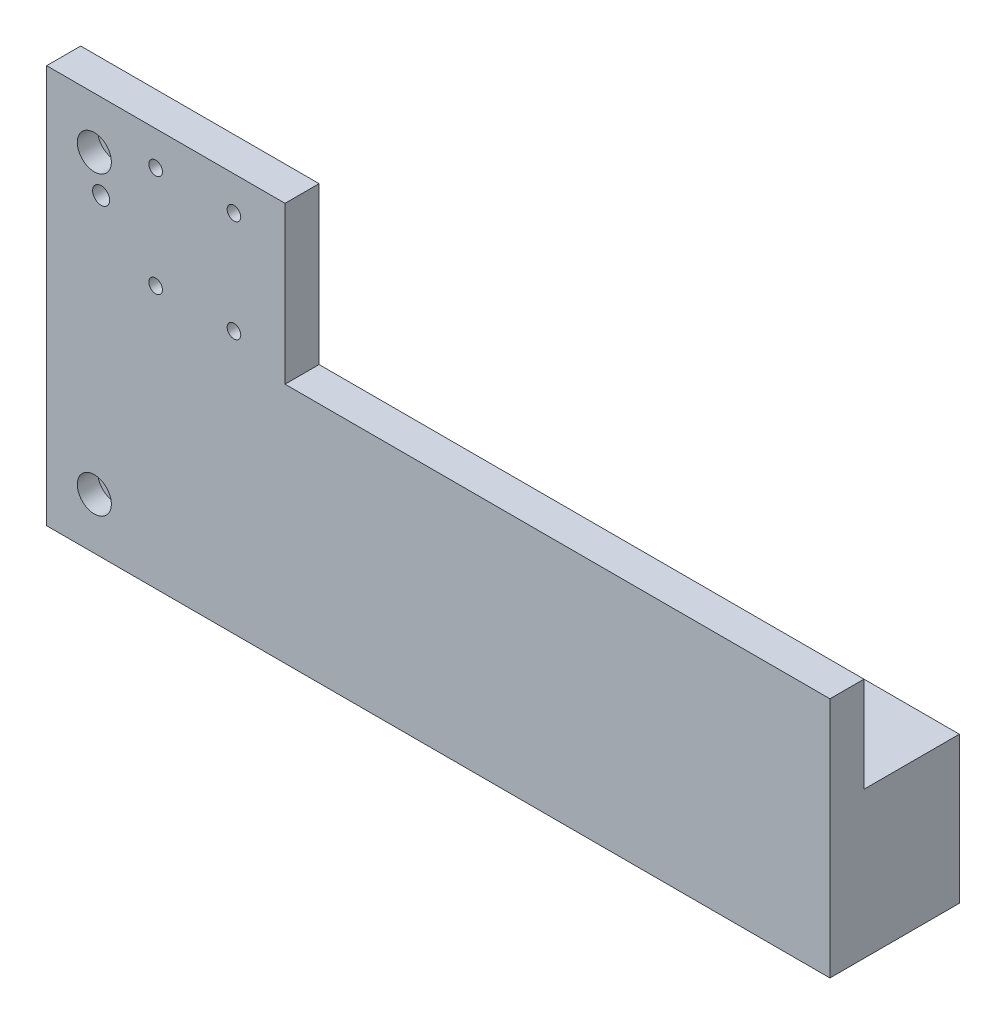
ISO-10303-21;
HEADER;
FILE_DESCRIPTION(('STEP AP214'),'2;1');
FILE_NAME('part.step','',(''),(''),'','','');
FILE_SCHEMA(('AUTOMOTIVE_DESIGN { 1 0 10303 214 1 1 1 1 }'));
ENDSEC;
DATA;
#1=APPLICATION_CONTEXT('core data for automotive mechanical design processes');
#2=APPLICATION_PROTOCOL_DEFINITION('international standard','automotive_design',2000,#1);
#3=PRODUCT_CONTEXT('',#1,'mechanical');
#4=PRODUCT('Part','Part','',(#3));
#5=PRODUCT_RELATED_PRODUCT_CATEGORY('part','',(#4));
#6=PRODUCT_DEFINITION_FORMATION('','',#4);
#7=PRODUCT_DEFINITION_CONTEXT('part definition',#1,'design');
#8=PRODUCT_DEFINITION('design','',#6,#7);
#9=PRODUCT_DEFINITION_SHAPE('','',#8);
#10=(LENGTH_UNIT() NAMED_UNIT(*) SI_UNIT(.MILLI.,.METRE.));
#11=(NAMED_UNIT(*) PLANE_ANGLE_UNIT() SI_UNIT($,.RADIAN.));
#12=(NAMED_UNIT(*) SI_UNIT($,.STERADIAN.) SOLID_ANGLE_UNIT());
#13=UNCERTAINTY_MEASURE_WITH_UNIT(LENGTH_MEASURE(1.E-05),#10,'distance_accuracy_value','');
#14=(GEOMETRIC_REPRESENTATION_CONTEXT(3) GLOBAL_UNCERTAINTY_ASSIGNED_CONTEXT((#13)) GLOBAL_UNIT_ASSIGNED_CONTEXT((#10,
#11,#12)) REPRESENTATION_CONTEXT('',''));
#15=CARTESIAN_POINT('',(0.,0.,0.));
#16=DIRECTION('',(0.,0.,1.));
#17=DIRECTION('',(1.,0.,0.));
#18=AXIS2_PLACEMENT_3D('',#15,#16,#17);
#19=CARTESIAN_POINT('',(14.,-15.,0.));
#20=DIRECTION('',(0.,0.,-1.));
#21=DIRECTION('',(-1.,0.,0.));
#22=AXIS2_PLACEMENT_3D('',#19,#20,#21);
#23=CYLINDRICAL_SURFACE('',#22,3.);
#24=CARTESIAN_POINT('',(14.,-15.,-10.));
#25=DIRECTION('',(0.,0.,-1.));
#26=DIRECTION('',(-1.,0.,0.));
#27=AXIS2_PLACEMENT_3D('',#24,#25,#26);
#28=CIRCLE('',#27,3.);
#29=CARTESIAN_POINT('',(11.,-15.,-10.));
#30=VERTEX_POINT('',#29);
#31=EDGE_CURVE('E162',#30,#30,#28,.T.);
#32=ORIENTED_EDGE('',*,*,#31,.T.);
#33=EDGE_LOOP('',(#32));
#34=FACE_BOUND('',#33,.T.);
#35=CARTESIAN_POINT('',(14.,-15.,-6.));
#36=DIRECTION('',(0.,0.,1.));
#37=DIRECTION('',(1.,0.,0.));
#38=AXIS2_PLACEMENT_3D('',#35,#36,#37);
#39=CIRCLE('',#38,3.);
#40=CARTESIAN_POINT('',(17.,-15.,-6.));
#41=VERTEX_POINT('',#40);
#42=EDGE_CURVE('E158',#41,#41,#39,.F.);
#43=ORIENTED_EDGE('',*,*,#42,.F.);
#44=EDGE_LOOP('',(#43));
#45=FACE_BOUND('',#44,.T.);
#46=ADVANCED_FACE('F35',(#34,#45),#23,.F.);
#47=CARTESIAN_POINT('',(14.,-102.,0.));
#48=DIRECTION('',(0.,0.,-1.));
#49=DIRECTION('',(-1.,0.,0.));
#50=AXIS2_PLACEMENT_3D('',#47,#48,#49);
#51=CYLINDRICAL_SURFACE('',#50,3.);
#52=CARTESIAN_POINT('',(14.,-102.,-10.));
#53=DIRECTION('',(0.,0.,-1.));
#54=DIRECTION('',(-1.,0.,0.));
#55=AXIS2_PLACEMENT_3D('',#52,#53,#54);
#56=CIRCLE('',#55,3.);
#57=CARTESIAN_POINT('',(11.,-102.,-10.));
#58=VERTEX_POINT('',#57);
#59=EDGE_CURVE('E123',#58,#58,#56,.T.);
#60=ORIENTED_EDGE('',*,*,#59,.T.);
#61=EDGE_LOOP('',(#60));
#62=FACE_BOUND('',#61,.T.);
#63=CARTESIAN_POINT('',(14.,-102.,-6.));
#64=DIRECTION('',(0.,0.,1.));
#65=DIRECTION('',(1.,0.,0.));
#66=AXIS2_PLACEMENT_3D('',#63,#64,#65);
#67=CIRCLE('',#66,3.);
#68=CARTESIAN_POINT('',(17.,-102.,-6.));
#69=VERTEX_POINT('',#68);
#70=EDGE_CURVE('E155',#69,#69,#67,.F.);
#71=ORIENTED_EDGE('',*,*,#70,.F.);
#72=EDGE_LOOP('',(#71));
#73=FACE_BOUND('',#72,.T.);
#74=ADVANCED_FACE('F249',(#62,#73),#51,.F.);
#75=CARTESIAN_POINT('',(0.,0.,-38.));
#76=DIRECTION('',(1.,0.,0.));
#77=DIRECTION('',(0.,1.,0.));
#78=AXIS2_PLACEMENT_3D('',#75,#76,#77);
#79=PLANE('',#78);
#80=DIRECTION('',(0.,-1.,0.));
#81=VECTOR('',#80,1.);
#82=CARTESIAN_POINT('',(0.,0.,-10.));
#83=LINE('',#82,#81);
#84=CARTESIAN_POINT('',(0.,0.,-10.));
#85=VERTEX_POINT('',#84);
#86=CARTESIAN_POINT('',(0.,-117.,-10.));
#87=VERTEX_POINT('',#86);
#88=EDGE_CURVE('E138',#85,#87,#83,.T.);
#89=ORIENTED_EDGE('',*,*,#88,.T.);
#90=DIRECTION('',(0.,0.,1.));
#91=VECTOR('',#90,1.);
#92=CARTESIAN_POINT('',(0.,-117.,-38.));
#93=LINE('',#92,#91);
#94=CARTESIAN_POINT('',(0.,-117.,0.));
#95=VERTEX_POINT('',#94);
#96=EDGE_CURVE('E51',#87,#95,#93,.T.);
#97=ORIENTED_EDGE('',*,*,#96,.T.);
#98=DIRECTION('',(0.,-1.,0.));
#99=VECTOR('',#98,1.);
#100=CARTESIAN_POINT('',(0.,0.,0.));
#101=LINE('',#100,#99);
#102=CARTESIAN_POINT('',(0.,0.,0.));
#103=VERTEX_POINT('',#102);
#104=EDGE_CURVE('E144',#103,#95,#101,.T.);
#105=ORIENTED_EDGE('',*,*,#104,.F.);
#106=DIRECTION('',(0.,0.,1.));
#107=VECTOR('',#106,1.);
#108=CARTESIAN_POINT('',(0.,0.,-38.));
#109=LINE('',#108,#107);
#110=EDGE_CURVE('E44',#85,#103,#109,.T.);
#111=ORIENTED_EDGE('',*,*,#110,.F.);
#112=EDGE_LOOP('',(#89,#97,#105,#111));
#113=FACE_BOUND('',#112,.T.);
#114=ADVANCED_FACE('F37',(#113),#79,.F.);
#115=CARTESIAN_POINT('',(0.,0.,-38.));
#116=DIRECTION('',(0.,-1.,0.));
#117=DIRECTION('',(0.,0.,1.));
#118=AXIS2_PLACEMENT_3D('',#115,#116,#117);
#119=PLANE('',#118);
#120=DIRECTION('',(-1.,0.,0.));
#121=VECTOR('',#120,1.);
#122=CARTESIAN_POINT('',(0.,0.,-10.));
#123=LINE('',#122,#121);
#124=CARTESIAN_POINT('',(70.,0.,-10.));
#125=VERTEX_POINT('',#124);
#126=EDGE_CURVE('E219',#125,#85,#123,.T.);
#127=ORIENTED_EDGE('',*,*,#126,.T.);
#128=ORIENTED_EDGE('',*,*,#110,.T.);
#129=DIRECTION('',(-1.,0.,0.));
#130=VECTOR('',#129,1.);
#131=CARTESIAN_POINT('',(0.,0.,0.));
#132=LINE('',#131,#130);
#133=CARTESIAN_POINT('',(70.,0.,0.));
#134=VERTEX_POINT('',#133);
#135=EDGE_CURVE('E147',#134,#103,#132,.T.);
#136=ORIENTED_EDGE('',*,*,#135,.F.);
#137=DIRECTION('',(0.,0.,-1.));
#138=VECTOR('',#137,1.);
#139=CARTESIAN_POINT('',(70.,0.,0.));
#140=LINE('',#139,#138);
#141=EDGE_CURVE('E209',#134,#125,#140,.T.);
#142=ORIENTED_EDGE('',*,*,#141,.T.);
#143=EDGE_LOOP('',(#127,#128,#136,#142));
#144=FACE_BOUND('',#143,.T.);
#145=ADVANCED_FACE('F242',(#144),#119,.F.);
#146=CARTESIAN_POINT('',(230.,0.,-38.));
#147=DIRECTION('',(-1.,0.,0.));
#148=DIRECTION('',(0.,-1.,0.));
#149=AXIS2_PLACEMENT_3D('',#146,#147,#148);
#150=PLANE('',#149);
#151=DIRECTION('',(0.,1.,0.));
#152=VECTOR('',#151,1.);
#153=CARTESIAN_POINT('',(230.,0.,0.));
#154=LINE('',#153,#152);
#155=CARTESIAN_POINT('',(230.,-117.,0.));
#156=VERTEX_POINT('',#155);
#157=CARTESIAN_POINT('',(230.,-46.,0.));
#158=VERTEX_POINT('',#157);
#159=EDGE_CURVE('E150',#156,#158,#154,.T.);
#160=ORIENTED_EDGE('',*,*,#159,.F.);
#161=DIRECTION('',(0.,0.,-1.));
#162=VECTOR('',#161,1.);
#163=CARTESIAN_POINT('',(230.,-117.,-38.));
#164=LINE('',#163,#162);
#165=CARTESIAN_POINT('',(230.,-117.,-38.));
#166=VERTEX_POINT('',#165);
#167=EDGE_CURVE('E194',#156,#166,#164,.T.);
#168=ORIENTED_EDGE('',*,*,#167,.T.);
#169=DIRECTION('',(0.,1.,0.));
#170=VECTOR('',#169,1.);
#171=CARTESIAN_POINT('',(230.,0.,-38.));
#172=LINE('',#171,#170);
#173=CARTESIAN_POINT('',(230.,-74.,-38.));
#174=VERTEX_POINT('',#173);
#175=EDGE_CURVE('E122',#166,#174,#172,.T.);
#176=ORIENTED_EDGE('',*,*,#175,.T.);
#177=DIRECTION('',(0.,0.,-1.));
#178=VECTOR('',#177,1.);
#179=CARTESIAN_POINT('',(230.,-74.,-10.));
#180=LINE('',#179,#178);
#181=CARTESIAN_POINT('',(230.,-74.,-10.));
#182=VERTEX_POINT('',#181);
#183=EDGE_CURVE('E141',#182,#174,#180,.T.);
#184=ORIENTED_EDGE('',*,*,#183,.F.);
#185=DIRECTION('',(0.,1.,0.));
#186=VECTOR('',#185,1.);
#187=CARTESIAN_POINT('',(230.,0.,-10.));
#188=LINE('',#187,#186);
#189=CARTESIAN_POINT('',(230.,-46.,-10.));
#190=VERTEX_POINT('',#189);
#191=EDGE_CURVE('E217',#182,#190,#188,.T.);
#192=ORIENTED_EDGE('',*,*,#191,.T.);
#193=DIRECTION('',(0.,0.,-1.));
#194=VECTOR('',#193,1.);
#195=CARTESIAN_POINT('',(230.,-46.,0.));
#196=LINE('',#195,#194);
#197=EDGE_CURVE('E130',#158,#190,#196,.T.);
#198=ORIENTED_EDGE('',*,*,#197,.F.);
#199=EDGE_LOOP('',(#160,#168,#176,#184,#192,#198));
#200=FACE_BOUND('',#199,.T.);
#201=ADVANCED_FACE('F236',(#200),#150,.F.);
#202=CARTESIAN_POINT('',(0.,0.,-38.));
#203=DIRECTION('',(0.,0.,-1.));
#204=DIRECTION('',(1.,0.,0.));
#205=AXIS2_PLACEMENT_3D('',#202,#203,#204);
#206=PLANE('',#205);
#207=DIRECTION('',(1.,0.,0.));
#208=VECTOR('',#207,1.);
#209=CARTESIAN_POINT('',(256.712852354479,-117.,-38.));
#210=LINE('',#209,#208);
#211=CARTESIAN_POINT('',(28.,-117.,-38.));
#212=VERTEX_POINT('',#211);
#213=EDGE_CURVE('E109',#212,#166,#210,.T.);
#214=ORIENTED_EDGE('',*,*,#213,.F.);
#215=DIRECTION('',(0.,1.,0.));
#216=VECTOR('',#215,1.);
#217=CARTESIAN_POINT('',(28.,-120.,-38.));
#218=LINE('',#217,#216);
#219=CARTESIAN_POINT('',(28.,-74.,-38.));
#220=VERTEX_POINT('',#219);
#221=EDGE_CURVE('E120',#212,#220,#218,.T.);
#222=ORIENTED_EDGE('',*,*,#221,.T.);
#223=DIRECTION('',(1.,0.,0.));
#224=VECTOR('',#223,1.);
#225=CARTESIAN_POINT('',(28.,-74.,-38.));
#226=LINE('',#225,#224);
#227=EDGE_CURVE('E129',#220,#174,#226,.T.);
#228=ORIENTED_EDGE('',*,*,#227,.T.);
#229=ORIENTED_EDGE('',*,*,#175,.F.);
#230=EDGE_LOOP('',(#214,#222,#228,#229));
#231=FACE_BOUND('',#230,.T.);
#232=ADVANCED_FACE('F118',(#231),#206,.T.);
#233=CARTESIAN_POINT('',(0.,0.,0.));
#234=DIRECTION('',(0.,0.,-1.));
#235=DIRECTION('',(1.,0.,0.));
#236=AXIS2_PLACEMENT_3D('',#233,#234,#235);
#237=PLANE('',#236);
#238=CARTESIAN_POINT('',(16.,-25.,0.));
#239=DIRECTION('',(0.,0.,1.));
#240=DIRECTION('',(1.,0.,0.));
#241=AXIS2_PLACEMENT_3D('',#238,#239,#240);
#242=CIRCLE('',#241,2.5);
#243=CARTESIAN_POINT('',(18.5,-25.,0.));
#244=VERTEX_POINT('',#243);
#245=EDGE_CURVE('E297',#244,#244,#242,.T.);
#246=ORIENTED_EDGE('',*,*,#245,.F.);
#247=EDGE_LOOP('',(#246));
#248=FACE_BOUND('',#247,.T.);
#249=CARTESIAN_POINT('',(32.,-40.,0.));
#250=DIRECTION('',(0.,0.,1.));
#251=DIRECTION('',(1.,0.,0.));
#252=AXIS2_PLACEMENT_3D('',#249,#250,#251);
#253=CIRCLE('',#252,2.);
#254=CARTESIAN_POINT('',(34.,-40.,0.));
#255=VERTEX_POINT('',#254);
#256=EDGE_CURVE('E301',#255,#255,#253,.T.);
#257=ORIENTED_EDGE('',*,*,#256,.F.);
#258=EDGE_LOOP('',(#257));
#259=FACE_BOUND('',#258,.T.);
#260=CARTESIAN_POINT('',(32.,-10.,0.));
#261=DIRECTION('',(0.,0.,1.));
#262=DIRECTION('',(1.,0.,0.));
#263=AXIS2_PLACEMENT_3D('',#260,#261,#262);
#264=CIRCLE('',#263,2.);
#265=CARTESIAN_POINT('',(34.,-10.,0.));
#266=VERTEX_POINT('',#265);
#267=EDGE_CURVE('E305',#266,#266,#264,.T.);
#268=ORIENTED_EDGE('',*,*,#267,.F.);
#269=EDGE_LOOP('',(#268));
#270=FACE_BOUND('',#269,.T.);
#271=CARTESIAN_POINT('',(55.,-10.,0.));
#272=DIRECTION('',(0.,0.,1.));
#273=DIRECTION('',(1.,0.,0.));
#274=AXIS2_PLACEMENT_3D('',#271,#272,#273);
#275=CIRCLE('',#274,2.);
#276=CARTESIAN_POINT('',(57.,-10.,0.));
#277=VERTEX_POINT('',#276);
#278=EDGE_CURVE('E309',#277,#277,#275,.T.);
#279=ORIENTED_EDGE('',*,*,#278,.F.);
#280=EDGE_LOOP('',(#279));
#281=FACE_BOUND('',#280,.T.);
#282=CARTESIAN_POINT('',(55.,-40.,0.));
#283=DIRECTION('',(0.,0.,1.));
#284=DIRECTION('',(1.,0.,0.));
#285=AXIS2_PLACEMENT_3D('',#282,#283,#284);
#286=CIRCLE('',#285,2.);
#287=CARTESIAN_POINT('',(57.,-40.,0.));
#288=VERTEX_POINT('',#287);
#289=EDGE_CURVE('E167',#288,#288,#286,.T.);
#290=ORIENTED_EDGE('',*,*,#289,.F.);
#291=EDGE_LOOP('',(#290));
#292=FACE_BOUND('',#291,.T.);
#293=CARTESIAN_POINT('',(14.,-15.,0.));
#294=DIRECTION('',(0.,0.,1.));
#295=DIRECTION('',(1.,0.,0.));
#296=AXIS2_PLACEMENT_3D('',#293,#294,#295);
#297=CIRCLE('',#296,5.);
#298=CARTESIAN_POINT('',(19.,-15.,0.));
#299=VERTEX_POINT('',#298);
#300=EDGE_CURVE('E183',#299,#299,#297,.T.);
#301=ORIENTED_EDGE('',*,*,#300,.F.);
#302=EDGE_LOOP('',(#301));
#303=FACE_BOUND('',#302,.T.);
#304=CARTESIAN_POINT('',(14.,-102.,0.));
#305=DIRECTION('',(0.,0.,1.));
#306=DIRECTION('',(1.,0.,0.));
#307=AXIS2_PLACEMENT_3D('',#304,#305,#306);
#308=CIRCLE('',#307,5.);
#309=CARTESIAN_POINT('',(19.,-102.,0.));
#310=VERTEX_POINT('',#309);
#311=EDGE_CURVE('E174',#310,#310,#308,.T.);
#312=ORIENTED_EDGE('',*,*,#311,.F.);
#313=EDGE_LOOP('',(#312));
#314=FACE_BOUND('',#313,.T.);
#315=ORIENTED_EDGE('',*,*,#104,.T.);
#316=DIRECTION('',(1.,0.,0.));
#317=VECTOR('',#316,1.);
#318=CARTESIAN_POINT('',(256.712852354479,-117.,0.));
#319=LINE('',#318,#317);
#320=EDGE_CURVE('E114',#95,#156,#319,.T.);
#321=ORIENTED_EDGE('',*,*,#320,.T.);
#322=ORIENTED_EDGE('',*,*,#159,.T.);
#323=DIRECTION('',(1.,0.,0.));
#324=VECTOR('',#323,1.);
#325=CARTESIAN_POINT('',(230.,-46.,0.));
#326=LINE('',#325,#324);
#327=CARTESIAN_POINT('',(70.,-46.,0.));
#328=VERTEX_POINT('',#327);
#329=EDGE_CURVE('E205',#328,#158,#326,.T.);
#330=ORIENTED_EDGE('',*,*,#329,.F.);
#331=DIRECTION('',(0.,-1.,0.));
#332=VECTOR('',#331,1.);
#333=CARTESIAN_POINT('',(70.,0.,0.));
#334=LINE('',#333,#332);
#335=EDGE_CURVE('E202',#134,#328,#334,.T.);
#336=ORIENTED_EDGE('',*,*,#335,.F.);
#337=ORIENTED_EDGE('',*,*,#135,.T.);
#338=EDGE_LOOP('',(#315,#321,#322,#330,#336,#337));
#339=FACE_BOUND('',#338,.T.);
#340=ADVANCED_FACE('F239',(#248,#259,#270,#281,#292,#303,#314,#339),#237,.F.);
#341=CARTESIAN_POINT('',(28.,-74.,-10.));
#342=DIRECTION('',(0.,-1.,0.));
#343=DIRECTION('',(0.,0.,1.));
#344=AXIS2_PLACEMENT_3D('',#341,#342,#343);
#345=PLANE('',#344);
#346=CARTESIAN_POINT('',(128.,-74.,-24.));
#347=DIRECTION('',(0.,1.,0.));
#348=DIRECTION('',(0.,0.,1.));
#349=AXIS2_PLACEMENT_3D('',#346,#347,#348);
#350=CIRCLE('',#349,2.99999999999999);
#351=CARTESIAN_POINT('',(128.,-74.,-21.));
#352=VERTEX_POINT('',#351);
#353=EDGE_CURVE('E196',#352,#352,#350,.T.);
#354=ORIENTED_EDGE('',*,*,#353,.F.);
#355=EDGE_LOOP('',(#354));
#356=FACE_BOUND('',#355,.T.);
#357=ORIENTED_EDGE('',*,*,#227,.F.);
#358=DIRECTION('',(0.,0.,-1.));
#359=VECTOR('',#358,1.);
#360=CARTESIAN_POINT('',(28.,-74.,-10.));
#361=LINE('',#360,#359);
#362=CARTESIAN_POINT('',(28.,-74.,-10.));
#363=VERTEX_POINT('',#362);
#364=EDGE_CURVE('E127',#363,#220,#361,.T.);
#365=ORIENTED_EDGE('',*,*,#364,.F.);
#366=DIRECTION('',(1.,0.,0.));
#367=VECTOR('',#366,1.);
#368=CARTESIAN_POINT('',(28.,-74.,-10.));
#369=LINE('',#368,#367);
#370=EDGE_CURVE('E215',#363,#182,#369,.T.);
#371=ORIENTED_EDGE('',*,*,#370,.T.);
#372=ORIENTED_EDGE('',*,*,#183,.T.);
#373=EDGE_LOOP('',(#357,#365,#371,#372));
#374=FACE_BOUND('',#373,.T.);
#375=ADVANCED_FACE('F233',(#356,#374),#345,.F.);
#376=CARTESIAN_POINT('',(28.,-120.,-10.));
#377=DIRECTION('',(1.,0.,0.));
#378=DIRECTION('',(0.,0.,1.));
#379=AXIS2_PLACEMENT_3D('',#376,#377,#378);
#380=PLANE('',#379);
#381=ORIENTED_EDGE('',*,*,#221,.F.);
#382=DIRECTION('',(0.,0.,1.));
#383=VECTOR('',#382,1.);
#384=CARTESIAN_POINT('',(28.,-117.,-10.));
#385=LINE('',#384,#383);
#386=CARTESIAN_POINT('',(28.,-117.,-10.));
#387=VERTEX_POINT('',#386);
#388=EDGE_CURVE('E106',#212,#387,#385,.T.);
#389=ORIENTED_EDGE('',*,*,#388,.T.);
#390=DIRECTION('',(0.,1.,0.));
#391=VECTOR('',#390,1.);
#392=CARTESIAN_POINT('',(28.,-120.,-10.));
#393=LINE('',#392,#391);
#394=EDGE_CURVE('E132',#387,#363,#393,.T.);
#395=ORIENTED_EDGE('',*,*,#394,.T.);
#396=ORIENTED_EDGE('',*,*,#364,.T.);
#397=EDGE_LOOP('',(#381,#389,#395,#396));
#398=FACE_BOUND('',#397,.T.);
#399=ADVANCED_FACE('F125',(#398),#380,.F.);
#400=CARTESIAN_POINT('',(0.,0.,-10.));
#401=DIRECTION('',(0.,0.,-1.));
#402=DIRECTION('',(1.,0.,0.));
#403=AXIS2_PLACEMENT_3D('',#400,#401,#402);
#404=PLANE('',#403);
#405=CARTESIAN_POINT('',(16.,-25.,-10.));
#406=DIRECTION('',(0.,0.,-1.));
#407=DIRECTION('',(-1.,0.,0.));
#408=AXIS2_PLACEMENT_3D('',#405,#406,#407);
#409=CIRCLE('',#408,2.5);
#410=CARTESIAN_POINT('',(13.5,-25.,-10.));
#411=VERTEX_POINT('',#410);
#412=EDGE_CURVE('E39',#411,#411,#409,.T.);
#413=ORIENTED_EDGE('',*,*,#412,.F.);
#414=EDGE_LOOP('',(#413));
#415=FACE_BOUND('',#414,.T.);
#416=CARTESIAN_POINT('',(32.,-40.,-10.));
#417=DIRECTION('',(0.,0.,-1.));
#418=DIRECTION('',(-1.,0.,0.));
#419=AXIS2_PLACEMENT_3D('',#416,#417,#418);
#420=CIRCLE('',#419,2.);
#421=CARTESIAN_POINT('',(30.,-40.,-10.));
#422=VERTEX_POINT('',#421);
#423=EDGE_CURVE('E172',#422,#422,#420,.T.);
#424=ORIENTED_EDGE('',*,*,#423,.F.);
#425=EDGE_LOOP('',(#424));
#426=FACE_BOUND('',#425,.T.);
#427=CARTESIAN_POINT('',(32.,-10.,-10.));
#428=DIRECTION('',(0.,0.,-1.));
#429=DIRECTION('',(-1.,0.,0.));
#430=AXIS2_PLACEMENT_3D('',#427,#428,#429);
#431=CIRCLE('',#430,2.);
#432=CARTESIAN_POINT('',(30.,-10.,-10.));
#433=VERTEX_POINT('',#432);
#434=EDGE_CURVE('E170',#433,#433,#431,.T.);
#435=ORIENTED_EDGE('',*,*,#434,.F.);
#436=EDGE_LOOP('',(#435));
#437=FACE_BOUND('',#436,.T.);
#438=CARTESIAN_POINT('',(55.,-10.,-10.));
#439=DIRECTION('',(0.,0.,-1.));
#440=DIRECTION('',(-1.,0.,0.));
#441=AXIS2_PLACEMENT_3D('',#438,#439,#440);
#442=CIRCLE('',#441,2.);
#443=CARTESIAN_POINT('',(53.,-10.,-10.));
#444=VERTEX_POINT('',#443);
#445=EDGE_CURVE('E166',#444,#444,#442,.T.);
#446=ORIENTED_EDGE('',*,*,#445,.F.);
#447=EDGE_LOOP('',(#446));
#448=FACE_BOUND('',#447,.T.);
#449=CARTESIAN_POINT('',(55.,-40.,-10.));
#450=DIRECTION('',(0.,0.,-1.));
#451=DIRECTION('',(-1.,0.,0.));
#452=AXIS2_PLACEMENT_3D('',#449,#450,#451);
#453=CIRCLE('',#452,2.);
#454=CARTESIAN_POINT('',(53.,-40.,-10.));
#455=VERTEX_POINT('',#454);
#456=EDGE_CURVE('E163',#455,#455,#453,.T.);
#457=ORIENTED_EDGE('',*,*,#456,.F.);
#458=EDGE_LOOP('',(#457));
#459=FACE_BOUND('',#458,.T.);
#460=ORIENTED_EDGE('',*,*,#59,.F.);
#461=EDGE_LOOP('',(#460));
#462=FACE_BOUND('',#461,.T.);
#463=ORIENTED_EDGE('',*,*,#31,.F.);
#464=EDGE_LOOP('',(#463));
#465=FACE_BOUND('',#464,.T.);
#466=DIRECTION('',(1.,0.,0.));
#467=VECTOR('',#466,1.);
#468=CARTESIAN_POINT('',(0.,-117.,-10.));
#469=LINE('',#468,#467);
#470=EDGE_CURVE('E11',#87,#387,#469,.T.);
#471=ORIENTED_EDGE('',*,*,#470,.F.);
#472=ORIENTED_EDGE('',*,*,#88,.F.);
#473=ORIENTED_EDGE('',*,*,#126,.F.);
#474=DIRECTION('',(0.,-1.,0.));
#475=VECTOR('',#474,1.);
#476=CARTESIAN_POINT('',(70.,0.,-10.));
#477=LINE('',#476,#475);
#478=CARTESIAN_POINT('',(70.,-46.,-10.));
#479=VERTEX_POINT('',#478);
#480=EDGE_CURVE('E59',#125,#479,#477,.T.);
#481=ORIENTED_EDGE('',*,*,#480,.T.);
#482=DIRECTION('',(1.,0.,0.));
#483=VECTOR('',#482,1.);
#484=CARTESIAN_POINT('',(230.,-46.,-10.));
#485=LINE('',#484,#483);
#486=EDGE_CURVE('E206',#479,#190,#485,.T.);
#487=ORIENTED_EDGE('',*,*,#486,.T.);
#488=ORIENTED_EDGE('',*,*,#191,.F.);
#489=ORIENTED_EDGE('',*,*,#370,.F.);
#490=ORIENTED_EDGE('',*,*,#394,.F.);
#491=EDGE_LOOP('',(#471,#472,#473,#481,#487,#488,#489,#490));
#492=FACE_BOUND('',#491,.T.);
#493=ADVANCED_FACE('F228',(#415,#426,#437,#448,#459,#462,#465,#492),#404,.T.);
#494=CARTESIAN_POINT('',(230.,-46.,0.));
#495=DIRECTION('',(0.,-1.,0.));
#496=DIRECTION('',(1.,0.,0.));
#497=AXIS2_PLACEMENT_3D('',#494,#495,#496);
#498=PLANE('',#497);
#499=ORIENTED_EDGE('',*,*,#486,.F.);
#500=DIRECTION('',(0.,0.,-1.));
#501=VECTOR('',#500,1.);
#502=CARTESIAN_POINT('',(70.,-46.,0.));
#503=LINE('',#502,#501);
#504=EDGE_CURVE('E135',#328,#479,#503,.T.);
#505=ORIENTED_EDGE('',*,*,#504,.F.);
#506=ORIENTED_EDGE('',*,*,#329,.T.);
#507=ORIENTED_EDGE('',*,*,#197,.T.);
#508=EDGE_LOOP('',(#499,#505,#506,#507));
#509=FACE_BOUND('',#508,.T.);
#510=ADVANCED_FACE('F274',(#509),#498,.F.);
#511=CARTESIAN_POINT('',(70.,0.,0.));
#512=DIRECTION('',(-1.,0.,0.));
#513=DIRECTION('',(0.,0.,-1.));
#514=AXIS2_PLACEMENT_3D('',#511,#512,#513);
#515=PLANE('',#514);
#516=ORIENTED_EDGE('',*,*,#480,.F.);
#517=ORIENTED_EDGE('',*,*,#141,.F.);
#518=ORIENTED_EDGE('',*,*,#335,.T.);
#519=ORIENTED_EDGE('',*,*,#504,.T.);
#520=EDGE_LOOP('',(#516,#517,#518,#519));
#521=FACE_BOUND('',#520,.T.);
#522=ADVANCED_FACE('F272',(#521),#515,.F.);
#523=CARTESIAN_POINT('',(128.,-84.,-24.));
#524=DIRECTION('',(0.,1.,0.));
#525=DIRECTION('',(0.,0.,1.));
#526=AXIS2_PLACEMENT_3D('',#523,#524,#525);
#527=CYLINDRICAL_SURFACE('',#526,2.99999999999999);
#528=CARTESIAN_POINT('',(128.,-84.,-24.));
#529=DIRECTION('',(0.,1.,0.));
#530=DIRECTION('',(0.,0.,1.));
#531=AXIS2_PLACEMENT_3D('',#528,#529,#530);
#532=CIRCLE('',#531,2.99999999999999);
#533=CARTESIAN_POINT('',(128.,-84.,-21.));
#534=VERTEX_POINT('',#533);
#535=EDGE_CURVE('E197',#534,#534,#532,.T.);
#536=ORIENTED_EDGE('',*,*,#535,.F.);
#537=EDGE_LOOP('',(#536));
#538=FACE_BOUND('',#537,.T.);
#539=ORIENTED_EDGE('',*,*,#353,.T.);
#540=EDGE_LOOP('',(#539));
#541=FACE_BOUND('',#540,.T.);
#542=ADVANCED_FACE('F268',(#538,#541),#527,.F.);
#543=CARTESIAN_POINT('',(128.,-84.,-24.));
#544=DIRECTION('',(0.,1.,0.));
#545=DIRECTION('',(0.,0.,1.));
#546=AXIS2_PLACEMENT_3D('',#543,#544,#545);
#547=PLANE('',#546);
#548=ORIENTED_EDGE('',*,*,#535,.T.);
#549=EDGE_LOOP('',(#548));
#550=FACE_BOUND('',#549,.T.);
#551=ADVANCED_FACE('F265',(#550),#547,.T.);
#552=CARTESIAN_POINT('',(256.712852354479,-117.,0.));
#553=DIRECTION('',(0.,1.,0.));
#554=DIRECTION('',(0.,0.,1.));
#555=AXIS2_PLACEMENT_3D('',#552,#553,#554);
#556=PLANE('',#555);
#557=ORIENTED_EDGE('',*,*,#320,.F.);
#558=ORIENTED_EDGE('',*,*,#96,.F.);
#559=ORIENTED_EDGE('',*,*,#470,.T.);
#560=ORIENTED_EDGE('',*,*,#388,.F.);
#561=ORIENTED_EDGE('',*,*,#213,.T.);
#562=ORIENTED_EDGE('',*,*,#167,.F.);
#563=EDGE_LOOP('',(#557,#558,#559,#560,#561,#562));
#564=FACE_BOUND('',#563,.T.);
#565=ADVANCED_FACE('F108',(#564),#556,.F.);
#566=CARTESIAN_POINT('',(14.,-102.,-6.));
#567=DIRECTION('',(0.,0.,1.));
#568=DIRECTION('',(1.,0.,0.));
#569=AXIS2_PLACEMENT_3D('',#566,#567,#568);
#570=PLANE('',#569);
#571=CARTESIAN_POINT('',(14.,-102.,-6.));
#572=DIRECTION('',(0.,0.,1.));
#573=DIRECTION('',(1.,0.,0.));
#574=AXIS2_PLACEMENT_3D('',#571,#572,#573);
#575=CIRCLE('',#574,5.);
#576=CARTESIAN_POINT('',(19.,-102.,-6.));
#577=VERTEX_POINT('',#576);
#578=EDGE_CURVE('E178',#577,#577,#575,.T.);
#579=ORIENTED_EDGE('',*,*,#578,.T.);
#580=EDGE_LOOP('',(#579));
#581=FACE_BOUND('',#580,.T.);
#582=ORIENTED_EDGE('',*,*,#70,.T.);
#583=EDGE_LOOP('',(#582));
#584=FACE_BOUND('',#583,.T.);
#585=ADVANCED_FACE('F264',(#581,#584),#570,.T.);
#586=CARTESIAN_POINT('',(14.,-102.,-6.));
#587=DIRECTION('',(0.,0.,1.));
#588=DIRECTION('',(1.,0.,0.));
#589=AXIS2_PLACEMENT_3D('',#586,#587,#588);
#590=CYLINDRICAL_SURFACE('',#589,5.);
#591=ORIENTED_EDGE('',*,*,#578,.F.);
#592=EDGE_LOOP('',(#591));
#593=FACE_BOUND('',#592,.T.);
#594=ORIENTED_EDGE('',*,*,#311,.T.);
#595=EDGE_LOOP('',(#594));
#596=FACE_BOUND('',#595,.T.);
#597=ADVANCED_FACE('F344',(#593,#596),#590,.F.);
#598=CARTESIAN_POINT('',(14.,-15.,-6.));
#599=DIRECTION('',(0.,0.,1.));
#600=DIRECTION('',(1.,0.,0.));
#601=AXIS2_PLACEMENT_3D('',#598,#599,#600);
#602=PLANE('',#601);
#603=CARTESIAN_POINT('',(14.,-15.,-6.));
#604=DIRECTION('',(0.,0.,1.));
#605=DIRECTION('',(1.,0.,0.));
#606=AXIS2_PLACEMENT_3D('',#603,#604,#605);
#607=CIRCLE('',#606,5.);
#608=CARTESIAN_POINT('',(19.,-15.,-6.));
#609=VERTEX_POINT('',#608);
#610=EDGE_CURVE('E159',#609,#609,#607,.T.);
#611=ORIENTED_EDGE('',*,*,#610,.T.);
#612=EDGE_LOOP('',(#611));
#613=FACE_BOUND('',#612,.T.);
#614=ORIENTED_EDGE('',*,*,#42,.T.);
#615=EDGE_LOOP('',(#614));
#616=FACE_BOUND('',#615,.T.);
#617=ADVANCED_FACE('F350',(#613,#616),#602,.T.);
#618=CARTESIAN_POINT('',(14.,-15.,-6.));
#619=DIRECTION('',(0.,0.,1.));
#620=DIRECTION('',(1.,0.,0.));
#621=AXIS2_PLACEMENT_3D('',#618,#619,#620);
#622=CYLINDRICAL_SURFACE('',#621,5.);
#623=ORIENTED_EDGE('',*,*,#610,.F.);
#624=EDGE_LOOP('',(#623));
#625=FACE_BOUND('',#624,.T.);
#626=ORIENTED_EDGE('',*,*,#300,.T.);
#627=EDGE_LOOP('',(#626));
#628=FACE_BOUND('',#627,.T.);
#629=ADVANCED_FACE('F353',(#625,#628),#622,.F.);
#630=CARTESIAN_POINT('',(55.,-40.,-38.));
#631=DIRECTION('',(0.,0.,1.));
#632=DIRECTION('',(1.,0.,0.));
#633=AXIS2_PLACEMENT_3D('',#630,#631,#632);
#634=CYLINDRICAL_SURFACE('',#633,2.);
#635=ORIENTED_EDGE('',*,*,#456,.T.);
#636=EDGE_LOOP('',(#635));
#637=FACE_BOUND('',#636,.T.);
#638=ORIENTED_EDGE('',*,*,#289,.T.);
#639=EDGE_LOOP('',(#638));
#640=FACE_BOUND('',#639,.T.);
#641=ADVANCED_FACE('F356',(#637,#640),#634,.F.);
#642=CARTESIAN_POINT('',(55.,-10.,-38.));
#643=DIRECTION('',(0.,0.,1.));
#644=DIRECTION('',(1.,0.,0.));
#645=AXIS2_PLACEMENT_3D('',#642,#643,#644);
#646=CYLINDRICAL_SURFACE('',#645,2.);
#647=ORIENTED_EDGE('',*,*,#445,.T.);
#648=EDGE_LOOP('',(#647));
#649=FACE_BOUND('',#648,.T.);
#650=ORIENTED_EDGE('',*,*,#278,.T.);
#651=EDGE_LOOP('',(#650));
#652=FACE_BOUND('',#651,.T.);
#653=ADVANCED_FACE('F363',(#649,#652),#646,.F.);
#654=CARTESIAN_POINT('',(32.,-10.,-38.));
#655=DIRECTION('',(0.,0.,1.));
#656=DIRECTION('',(1.,0.,0.));
#657=AXIS2_PLACEMENT_3D('',#654,#655,#656);
#658=CYLINDRICAL_SURFACE('',#657,2.);
#659=ORIENTED_EDGE('',*,*,#434,.T.);
#660=EDGE_LOOP('',(#659));
#661=FACE_BOUND('',#660,.T.);
#662=ORIENTED_EDGE('',*,*,#267,.T.);
#663=EDGE_LOOP('',(#662));
#664=FACE_BOUND('',#663,.T.);
#665=ADVANCED_FACE('F368',(#661,#664),#658,.F.);
#666=CARTESIAN_POINT('',(32.,-40.,-38.));
#667=DIRECTION('',(0.,0.,1.));
#668=DIRECTION('',(1.,0.,0.));
#669=AXIS2_PLACEMENT_3D('',#666,#667,#668);
#670=CYLINDRICAL_SURFACE('',#669,2.);
#671=ORIENTED_EDGE('',*,*,#423,.T.);
#672=EDGE_LOOP('',(#671));
#673=FACE_BOUND('',#672,.T.);
#674=ORIENTED_EDGE('',*,*,#256,.T.);
#675=EDGE_LOOP('',(#674));
#676=FACE_BOUND('',#675,.T.);
#677=ADVANCED_FACE('F365',(#673,#676),#670,.F.);
#678=CARTESIAN_POINT('',(16.,-25.,-38.));
#679=DIRECTION('',(0.,0.,1.));
#680=DIRECTION('',(1.,0.,0.));
#681=AXIS2_PLACEMENT_3D('',#678,#679,#680);
#682=CYLINDRICAL_SURFACE('',#681,2.5);
#683=ORIENTED_EDGE('',*,*,#412,.T.);
#684=EDGE_LOOP('',(#683));
#685=FACE_BOUND('',#684,.T.);
#686=ORIENTED_EDGE('',*,*,#245,.T.);
#687=EDGE_LOOP('',(#686));
#688=FACE_BOUND('',#687,.T.);
#689=ADVANCED_FACE('F328',(#685,#688),#682,.F.);
#690=CLOSED_SHELL('',(#46,#74,#114,#145,#201,#232,#340,#375,#399,#493,#510,#522,#542,#551,#565,
#585,#597,#617,#629,#641,#653,#665,#677,#689));
#691=MANIFOLD_SOLID_BREP('B2',#690);
#692=ADVANCED_BREP_SHAPE_REPRESENTATION('',(#18,#691),#14);
#693=SHAPE_DEFINITION_REPRESENTATION(#9,#692);
ENDSEC;
END-ISO-10303-21;
